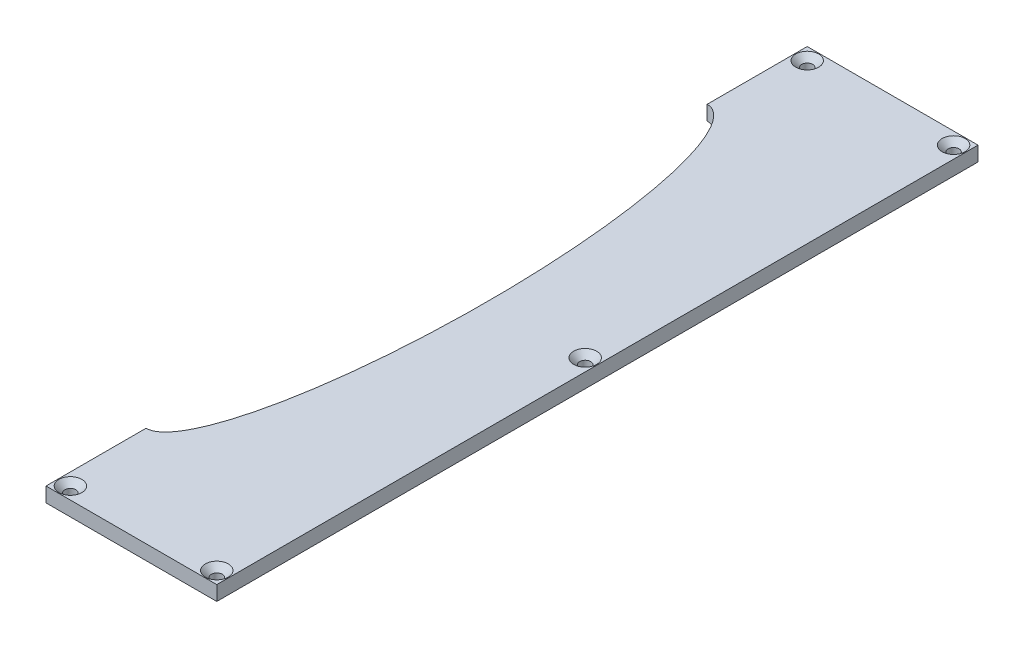
ISO-10303-21;
HEADER;
FILE_DESCRIPTION(('STEP AP214'),'2;1');
FILE_NAME('part.step','',(''),(''),'','','');
FILE_SCHEMA(('AUTOMOTIVE_DESIGN { 1 0 10303 214 1 1 1 1 }'));
ENDSEC;
DATA;
#1=APPLICATION_CONTEXT('core data for automotive mechanical design processes');
#2=APPLICATION_PROTOCOL_DEFINITION('international standard','automotive_design',2000,#1);
#3=PRODUCT_CONTEXT('',#1,'mechanical');
#4=PRODUCT('Part','Part','',(#3));
#5=PRODUCT_RELATED_PRODUCT_CATEGORY('part','',(#4));
#6=PRODUCT_DEFINITION_FORMATION('','',#4);
#7=PRODUCT_DEFINITION_CONTEXT('part definition',#1,'design');
#8=PRODUCT_DEFINITION('design','',#6,#7);
#9=PRODUCT_DEFINITION_SHAPE('','',#8);
#10=(LENGTH_UNIT() NAMED_UNIT(*) SI_UNIT(.MILLI.,.METRE.));
#11=(NAMED_UNIT(*) PLANE_ANGLE_UNIT() SI_UNIT($,.RADIAN.));
#12=(NAMED_UNIT(*) SI_UNIT($,.STERADIAN.) SOLID_ANGLE_UNIT());
#13=UNCERTAINTY_MEASURE_WITH_UNIT(LENGTH_MEASURE(1.E-05),#10,'distance_accuracy_value','');
#14=(GEOMETRIC_REPRESENTATION_CONTEXT(3) GLOBAL_UNCERTAINTY_ASSIGNED_CONTEXT((#13)) GLOBAL_UNIT_ASSIGNED_CONTEXT((#10,
#11,#12)) REPRESENTATION_CONTEXT('',''));
#15=CARTESIAN_POINT('',(0.,0.,0.));
#16=DIRECTION('',(0.,0.,1.));
#17=DIRECTION('',(1.,0.,0.));
#18=AXIS2_PLACEMENT_3D('',#15,#16,#17);
#19=CARTESIAN_POINT('',(0.,6.,0.));
#20=DIRECTION('',(0.,1.,0.));
#21=DIRECTION('',(0.,0.,-1.));
#22=AXIS2_PLACEMENT_3D('',#19,#20,#21);
#23=ELLIPSE('',#22,115.,25.);
#24=DIRECTION('',(0.,-1.,0.));
#25=VECTOR('',#24,1.);
#26=SURFACE_OF_LINEAR_EXTRUSION('',#23,#25);
#27=CARTESIAN_POINT('',(0.,0.,0.));
#28=DIRECTION('',(0.,1.,0.));
#29=DIRECTION('',(0.,0.,-1.));
#30=AXIS2_PLACEMENT_3D('',#27,#28,#29);
#31=ELLIPSE('',#30,115.,25.);
#32=CARTESIAN_POINT('',(0.,0.,115.));
#33=VERTEX_POINT('',#32);
#34=CARTESIAN_POINT('',(0.,0.,-115.));
#35=VERTEX_POINT('',#34);
#36=EDGE_CURVE('E129',#33,#35,#31,.T.);
#37=ORIENTED_EDGE('',*,*,#36,.F.);
#38=DIRECTION('',(0.,-1.,0.));
#39=VECTOR('',#38,1.);
#40=CARTESIAN_POINT('',(0.,6.,115.));
#41=LINE('',#40,#39);
#42=CARTESIAN_POINT('',(0.,6.,115.));
#43=VERTEX_POINT('',#42);
#44=EDGE_CURVE('E11',#43,#33,#41,.T.);
#45=ORIENTED_EDGE('',*,*,#44,.F.);
#46=CARTESIAN_POINT('',(0.,6.,-115.));
#47=VERTEX_POINT('',#46);
#48=EDGE_CURVE('E150',#43,#47,#23,.T.);
#49=ORIENTED_EDGE('',*,*,#48,.T.);
#50=DIRECTION('',(0.,-1.,0.));
#51=VECTOR('',#50,1.);
#52=CARTESIAN_POINT('',(0.,6.,-115.));
#53=LINE('',#52,#51);
#54=EDGE_CURVE('E60',#47,#35,#53,.T.);
#55=ORIENTED_EDGE('',*,*,#54,.T.);
#56=EDGE_LOOP('',(#37,#45,#49,#55));
#57=FACE_BOUND('',#56,.T.);
#58=ADVANCED_FACE('F40',(#57),#26,.T.);
#59=CARTESIAN_POINT('',(0.,6.,0.));
#60=DIRECTION('',(-1.,0.,0.));
#61=DIRECTION('',(0.,0.,1.));
#62=AXIS2_PLACEMENT_3D('',#59,#60,#61);
#63=PLANE('',#62);
#64=DIRECTION('',(0.,0.,-1.));
#65=VECTOR('',#64,1.);
#66=CARTESIAN_POINT('',(0.,0.,0.));
#67=LINE('',#66,#65);
#68=CARTESIAN_POINT('',(0.,0.,156.));
#69=VERTEX_POINT('',#68);
#70=EDGE_CURVE('E132',#69,#33,#67,.T.);
#71=ORIENTED_EDGE('',*,*,#70,.F.);
#72=DIRECTION('',(0.,-1.,0.));
#73=VECTOR('',#72,1.);
#74=CARTESIAN_POINT('',(0.,6.,156.));
#75=LINE('',#74,#73);
#76=CARTESIAN_POINT('',(0.,6.,156.));
#77=VERTEX_POINT('',#76);
#78=EDGE_CURVE('E51',#77,#69,#75,.T.);
#79=ORIENTED_EDGE('',*,*,#78,.F.);
#80=DIRECTION('',(0.,0.,-1.));
#81=VECTOR('',#80,1.);
#82=CARTESIAN_POINT('',(0.,6.,0.));
#83=LINE('',#82,#81);
#84=EDGE_CURVE('E212',#77,#43,#83,.T.);
#85=ORIENTED_EDGE('',*,*,#84,.T.);
#86=ORIENTED_EDGE('',*,*,#44,.T.);
#87=EDGE_LOOP('',(#71,#79,#85,#86));
#88=FACE_BOUND('',#87,.T.);
#89=ADVANCED_FACE('F235',(#88),#63,.T.);
#90=CARTESIAN_POINT('',(0.,6.,156.));
#91=DIRECTION('',(0.,0.,1.));
#92=DIRECTION('',(1.,0.,0.));
#93=AXIS2_PLACEMENT_3D('',#90,#91,#92);
#94=PLANE('',#93);
#95=DIRECTION('',(-1.,0.,0.));
#96=VECTOR('',#95,1.);
#97=CARTESIAN_POINT('',(0.,0.,156.));
#98=LINE('',#97,#96);
#99=CARTESIAN_POINT('',(70.0000000000001,0.,156.));
#100=VERTEX_POINT('',#99);
#101=EDGE_CURVE('E137',#100,#69,#98,.T.);
#102=ORIENTED_EDGE('',*,*,#101,.F.);
#103=DIRECTION('',(0.,-1.,0.));
#104=VECTOR('',#103,1.);
#105=CARTESIAN_POINT('',(70.0000000000001,6.,156.));
#106=LINE('',#105,#104);
#107=CARTESIAN_POINT('',(70.0000000000001,6.,156.));
#108=VERTEX_POINT('',#107);
#109=EDGE_CURVE('E108',#108,#100,#106,.T.);
#110=ORIENTED_EDGE('',*,*,#109,.F.);
#111=DIRECTION('',(-1.,0.,0.));
#112=VECTOR('',#111,1.);
#113=CARTESIAN_POINT('',(0.,6.,156.));
#114=LINE('',#113,#112);
#115=EDGE_CURVE('E118',#108,#77,#114,.T.);
#116=ORIENTED_EDGE('',*,*,#115,.T.);
#117=ORIENTED_EDGE('',*,*,#78,.T.);
#118=EDGE_LOOP('',(#102,#110,#116,#117));
#119=FACE_BOUND('',#118,.T.);
#120=ADVANCED_FACE('F218',(#119),#94,.T.);
#121=CARTESIAN_POINT('',(70.,6.,0.));
#122=DIRECTION('',(1.,0.,0.));
#123=DIRECTION('',(0.,0.,-1.));
#124=AXIS2_PLACEMENT_3D('',#121,#122,#123);
#125=PLANE('',#124);
#126=DIRECTION('',(0.,0.,1.));
#127=VECTOR('',#126,1.);
#128=CARTESIAN_POINT('',(70.,0.,0.));
#129=LINE('',#128,#127);
#130=CARTESIAN_POINT('',(70.,0.,-156.));
#131=VERTEX_POINT('',#130);
#132=EDGE_CURVE('E103',#131,#100,#129,.T.);
#133=ORIENTED_EDGE('',*,*,#132,.F.);
#134=DIRECTION('',(0.,-1.,0.));
#135=VECTOR('',#134,1.);
#136=CARTESIAN_POINT('',(70.,6.,-156.));
#137=LINE('',#136,#135);
#138=CARTESIAN_POINT('',(70.,6.,-156.));
#139=VERTEX_POINT('',#138);
#140=EDGE_CURVE('E98',#139,#131,#137,.T.);
#141=ORIENTED_EDGE('',*,*,#140,.F.);
#142=DIRECTION('',(0.,0.,1.));
#143=VECTOR('',#142,1.);
#144=CARTESIAN_POINT('',(70.,6.,0.));
#145=LINE('',#144,#143);
#146=EDGE_CURVE('E101',#139,#108,#145,.T.);
#147=ORIENTED_EDGE('',*,*,#146,.T.);
#148=ORIENTED_EDGE('',*,*,#109,.T.);
#149=EDGE_LOOP('',(#133,#141,#147,#148));
#150=FACE_BOUND('',#149,.T.);
#151=ADVANCED_FACE('F100',(#150),#125,.T.);
#152=CARTESIAN_POINT('',(0.,6.,-156.));
#153=DIRECTION('',(0.,0.,-1.));
#154=DIRECTION('',(-1.,0.,0.));
#155=AXIS2_PLACEMENT_3D('',#152,#153,#154);
#156=PLANE('',#155);
#157=DIRECTION('',(1.,0.,0.));
#158=VECTOR('',#157,1.);
#159=CARTESIAN_POINT('',(0.,0.,-156.));
#160=LINE('',#159,#158);
#161=CARTESIAN_POINT('',(0.,0.,-156.));
#162=VERTEX_POINT('',#161);
#163=EDGE_CURVE('E143',#162,#131,#160,.T.);
#164=ORIENTED_EDGE('',*,*,#163,.F.);
#165=DIRECTION('',(0.,-1.,0.));
#166=VECTOR('',#165,1.);
#167=CARTESIAN_POINT('',(0.,6.,-156.));
#168=LINE('',#167,#166);
#169=CARTESIAN_POINT('',(0.,6.,-156.));
#170=VERTEX_POINT('',#169);
#171=EDGE_CURVE('E79',#170,#162,#168,.T.);
#172=ORIENTED_EDGE('',*,*,#171,.F.);
#173=DIRECTION('',(1.,0.,0.));
#174=VECTOR('',#173,1.);
#175=CARTESIAN_POINT('',(0.,6.,-156.));
#176=LINE('',#175,#174);
#177=EDGE_CURVE('E115',#170,#139,#176,.T.);
#178=ORIENTED_EDGE('',*,*,#177,.T.);
#179=ORIENTED_EDGE('',*,*,#140,.T.);
#180=EDGE_LOOP('',(#164,#172,#178,#179));
#181=FACE_BOUND('',#180,.T.);
#182=ADVANCED_FACE('F121',(#181),#156,.T.);
#183=CARTESIAN_POINT('',(0.,6.,0.));
#184=DIRECTION('',(-1.,0.,0.));
#185=DIRECTION('',(0.,0.,1.));
#186=AXIS2_PLACEMENT_3D('',#183,#184,#185);
#187=PLANE('',#186);
#188=DIRECTION('',(0.,0.,-1.));
#189=VECTOR('',#188,1.);
#190=CARTESIAN_POINT('',(0.,0.,0.));
#191=LINE('',#190,#189);
#192=EDGE_CURVE('E146',#35,#162,#191,.T.);
#193=ORIENTED_EDGE('',*,*,#192,.F.);
#194=ORIENTED_EDGE('',*,*,#54,.F.);
#195=DIRECTION('',(0.,0.,-1.));
#196=VECTOR('',#195,1.);
#197=CARTESIAN_POINT('',(0.,6.,0.));
#198=LINE('',#197,#196);
#199=EDGE_CURVE('E123',#47,#170,#198,.T.);
#200=ORIENTED_EDGE('',*,*,#199,.T.);
#201=ORIENTED_EDGE('',*,*,#171,.T.);
#202=EDGE_LOOP('',(#193,#194,#200,#201));
#203=FACE_BOUND('',#202,.T.);
#204=ADVANCED_FACE('F222',(#203),#187,.T.);
#205=CARTESIAN_POINT('',(0.,6.,0.));
#206=DIRECTION('',(0.,1.,0.));
#207=DIRECTION('',(0.,0.,1.));
#208=AXIS2_PLACEMENT_3D('',#205,#206,#207);
#209=PLANE('',#208);
#210=CARTESIAN_POINT('',(5.,6.,-151.));
#211=DIRECTION('',(0.,1.,0.));
#212=DIRECTION('',(0.,0.,1.));
#213=AXIS2_PLACEMENT_3D('',#210,#211,#212);
#214=CIRCLE('',#213,4.7);
#215=CARTESIAN_POINT('',(5.,6.,-146.3));
#216=VERTEX_POINT('',#215);
#217=EDGE_CURVE('E376',#216,#216,#214,.T.);
#218=ORIENTED_EDGE('',*,*,#217,.F.);
#219=EDGE_LOOP('',(#218));
#220=FACE_BOUND('',#219,.T.);
#221=CARTESIAN_POINT('',(65.,6.,-151.));
#222=DIRECTION('',(0.,1.,0.));
#223=DIRECTION('',(0.,0.,1.));
#224=AXIS2_PLACEMENT_3D('',#221,#222,#223);
#225=CIRCLE('',#224,4.7);
#226=CARTESIAN_POINT('',(65.,6.,-146.3));
#227=VERTEX_POINT('',#226);
#228=EDGE_CURVE('E186',#227,#227,#225,.T.);
#229=ORIENTED_EDGE('',*,*,#228,.F.);
#230=EDGE_LOOP('',(#229));
#231=FACE_BOUND('',#230,.T.);
#232=CARTESIAN_POINT('',(65.,6.,0.));
#233=DIRECTION('',(0.,1.,0.));
#234=DIRECTION('',(0.,0.,1.));
#235=AXIS2_PLACEMENT_3D('',#232,#233,#234);
#236=CIRCLE('',#235,4.7);
#237=CARTESIAN_POINT('',(65.,6.,4.7));
#238=VERTEX_POINT('',#237);
#239=EDGE_CURVE('E177',#238,#238,#236,.T.);
#240=ORIENTED_EDGE('',*,*,#239,.F.);
#241=EDGE_LOOP('',(#240));
#242=FACE_BOUND('',#241,.T.);
#243=CARTESIAN_POINT('',(65.,6.,151.));
#244=DIRECTION('',(0.,1.,0.));
#245=DIRECTION('',(0.,0.,1.));
#246=AXIS2_PLACEMENT_3D('',#243,#244,#245);
#247=CIRCLE('',#246,4.7);
#248=CARTESIAN_POINT('',(65.,6.,155.7));
#249=VERTEX_POINT('',#248);
#250=EDGE_CURVE('E172',#249,#249,#247,.T.);
#251=ORIENTED_EDGE('',*,*,#250,.F.);
#252=EDGE_LOOP('',(#251));
#253=FACE_BOUND('',#252,.T.);
#254=CARTESIAN_POINT('',(5.,6.,151.));
#255=DIRECTION('',(0.,1.,0.));
#256=DIRECTION('',(0.,0.,1.));
#257=AXIS2_PLACEMENT_3D('',#254,#255,#256);
#258=CIRCLE('',#257,4.7);
#259=CARTESIAN_POINT('',(5.,6.,155.7));
#260=VERTEX_POINT('',#259);
#261=EDGE_CURVE('E167',#260,#260,#258,.T.);
#262=ORIENTED_EDGE('',*,*,#261,.F.);
#263=EDGE_LOOP('',(#262));
#264=FACE_BOUND('',#263,.T.);
#265=ORIENTED_EDGE('',*,*,#48,.F.);
#266=ORIENTED_EDGE('',*,*,#84,.F.);
#267=ORIENTED_EDGE('',*,*,#115,.F.);
#268=ORIENTED_EDGE('',*,*,#146,.F.);
#269=ORIENTED_EDGE('',*,*,#177,.F.);
#270=ORIENTED_EDGE('',*,*,#199,.F.);
#271=EDGE_LOOP('',(#265,#266,#267,#268,#269,#270));
#272=FACE_BOUND('',#271,.T.);
#273=ADVANCED_FACE('F113',(#220,#231,#242,#253,#264,#272),#209,.T.);
#274=CARTESIAN_POINT('',(0.,0.,0.));
#275=DIRECTION('',(0.,1.,0.));
#276=DIRECTION('',(0.,0.,1.));
#277=AXIS2_PLACEMENT_3D('',#274,#275,#276);
#278=PLANE('',#277);
#279=CARTESIAN_POINT('',(5.,0.,-151.));
#280=DIRECTION('',(0.,1.,0.));
#281=DIRECTION('',(0.,0.,1.));
#282=AXIS2_PLACEMENT_3D('',#279,#280,#281);
#283=CIRCLE('',#282,2.24999999999999);
#284=CARTESIAN_POINT('',(5.,0.,-148.75));
#285=VERTEX_POINT('',#284);
#286=EDGE_CURVE('E44',#285,#285,#283,.T.);
#287=ORIENTED_EDGE('',*,*,#286,.T.);
#288=EDGE_LOOP('',(#287));
#289=FACE_BOUND('',#288,.T.);
#290=CARTESIAN_POINT('',(65.,0.,-151.));
#291=DIRECTION('',(0.,1.,0.));
#292=DIRECTION('',(0.,0.,1.));
#293=AXIS2_PLACEMENT_3D('',#290,#291,#292);
#294=CIRCLE('',#293,2.24999999999999);
#295=CARTESIAN_POINT('',(65.,0.,-148.75));
#296=VERTEX_POINT('',#295);
#297=EDGE_CURVE('E174',#296,#296,#294,.T.);
#298=ORIENTED_EDGE('',*,*,#297,.T.);
#299=EDGE_LOOP('',(#298));
#300=FACE_BOUND('',#299,.T.);
#301=CARTESIAN_POINT('',(65.,0.,0.));
#302=DIRECTION('',(0.,1.,0.));
#303=DIRECTION('',(0.,0.,1.));
#304=AXIS2_PLACEMENT_3D('',#301,#302,#303);
#305=CIRCLE('',#304,2.24999999999999);
#306=CARTESIAN_POINT('',(65.,0.,2.24999999999999));
#307=VERTEX_POINT('',#306);
#308=EDGE_CURVE('E169',#307,#307,#305,.T.);
#309=ORIENTED_EDGE('',*,*,#308,.T.);
#310=EDGE_LOOP('',(#309));
#311=FACE_BOUND('',#310,.T.);
#312=CARTESIAN_POINT('',(65.,0.,151.));
#313=DIRECTION('',(0.,1.,0.));
#314=DIRECTION('',(0.,0.,1.));
#315=AXIS2_PLACEMENT_3D('',#312,#313,#314);
#316=CIRCLE('',#315,2.24999999999999);
#317=CARTESIAN_POINT('',(65.,0.,153.25));
#318=VERTEX_POINT('',#317);
#319=EDGE_CURVE('E163',#318,#318,#316,.T.);
#320=ORIENTED_EDGE('',*,*,#319,.T.);
#321=EDGE_LOOP('',(#320));
#322=FACE_BOUND('',#321,.T.);
#323=CARTESIAN_POINT('',(5.,0.,151.));
#324=DIRECTION('',(0.,1.,0.));
#325=DIRECTION('',(0.,0.,1.));
#326=AXIS2_PLACEMENT_3D('',#323,#324,#325);
#327=CIRCLE('',#326,2.24999999999999);
#328=CARTESIAN_POINT('',(5.,0.,153.25));
#329=VERTEX_POINT('',#328);
#330=EDGE_CURVE('E133',#329,#329,#327,.T.);
#331=ORIENTED_EDGE('',*,*,#330,.T.);
#332=EDGE_LOOP('',(#331));
#333=FACE_BOUND('',#332,.T.);
#334=ORIENTED_EDGE('',*,*,#36,.T.);
#335=ORIENTED_EDGE('',*,*,#192,.T.);
#336=ORIENTED_EDGE('',*,*,#163,.T.);
#337=ORIENTED_EDGE('',*,*,#132,.T.);
#338=ORIENTED_EDGE('',*,*,#101,.T.);
#339=ORIENTED_EDGE('',*,*,#70,.T.);
#340=EDGE_LOOP('',(#334,#335,#336,#337,#338,#339));
#341=FACE_BOUND('',#340,.T.);
#342=ADVANCED_FACE('F221',(#289,#300,#311,#322,#333,#341),#278,.F.);
#343=CARTESIAN_POINT('',(5.,6.,151.));
#344=DIRECTION('',(0.,1.,0.));
#345=DIRECTION('',(0.,0.,1.));
#346=AXIS2_PLACEMENT_3D('',#343,#344,#345);
#347=CYLINDRICAL_SURFACE('',#346,2.24999999999999);
#348=CARTESIAN_POINT('',(5.,3.54999999999999,151.));
#349=DIRECTION('',(0.,1.,0.));
#350=DIRECTION('',(0.,0.,1.));
#351=AXIS2_PLACEMENT_3D('',#348,#349,#350);
#352=CIRCLE('',#351,2.24999999999999);
#353=CARTESIAN_POINT('',(5.,3.54999999999999,153.25));
#354=VERTEX_POINT('',#353);
#355=EDGE_CURVE('E162',#354,#354,#352,.T.);
#356=ORIENTED_EDGE('',*,*,#355,.T.);
#357=EDGE_LOOP('',(#356));
#358=FACE_BOUND('',#357,.T.);
#359=ORIENTED_EDGE('',*,*,#330,.F.);
#360=EDGE_LOOP('',(#359));
#361=FACE_BOUND('',#360,.T.);
#362=ADVANCED_FACE('F269',(#358,#361),#347,.F.);
#363=CARTESIAN_POINT('',(5.,6.,151.));
#364=DIRECTION('',(0.,1.,0.));
#365=DIRECTION('',(0.,0.,1.));
#366=AXIS2_PLACEMENT_3D('',#363,#364,#365);
#367=CONICAL_SURFACE('',#366,4.7,0.785398163397449);
#368=ORIENTED_EDGE('',*,*,#355,.F.);
#369=EDGE_LOOP('',(#368));
#370=FACE_BOUND('',#369,.T.);
#371=ORIENTED_EDGE('',*,*,#261,.T.);
#372=EDGE_LOOP('',(#371));
#373=FACE_BOUND('',#372,.T.);
#374=ADVANCED_FACE('F277',(#370,#373),#367,.F.);
#375=CARTESIAN_POINT('',(65.,6.,151.));
#376=DIRECTION('',(0.,1.,0.));
#377=DIRECTION('',(0.,0.,1.));
#378=AXIS2_PLACEMENT_3D('',#375,#376,#377);
#379=CYLINDRICAL_SURFACE('',#378,2.24999999999999);
#380=CARTESIAN_POINT('',(65.,3.54999999999999,151.));
#381=DIRECTION('',(0.,1.,0.));
#382=DIRECTION('',(0.,0.,1.));
#383=AXIS2_PLACEMENT_3D('',#380,#381,#382);
#384=CIRCLE('',#383,2.24999999999999);
#385=CARTESIAN_POINT('',(65.,3.54999999999999,153.25));
#386=VERTEX_POINT('',#385);
#387=EDGE_CURVE('E168',#386,#386,#384,.T.);
#388=ORIENTED_EDGE('',*,*,#387,.T.);
#389=EDGE_LOOP('',(#388));
#390=FACE_BOUND('',#389,.T.);
#391=ORIENTED_EDGE('',*,*,#319,.F.);
#392=EDGE_LOOP('',(#391));
#393=FACE_BOUND('',#392,.T.);
#394=ADVANCED_FACE('F287',(#390,#393),#379,.F.);
#395=CARTESIAN_POINT('',(65.,6.,151.));
#396=DIRECTION('',(0.,1.,0.));
#397=DIRECTION('',(0.,0.,1.));
#398=AXIS2_PLACEMENT_3D('',#395,#396,#397);
#399=CONICAL_SURFACE('',#398,4.7,0.785398163397448);
#400=ORIENTED_EDGE('',*,*,#387,.F.);
#401=EDGE_LOOP('',(#400));
#402=FACE_BOUND('',#401,.T.);
#403=ORIENTED_EDGE('',*,*,#250,.T.);
#404=EDGE_LOOP('',(#403));
#405=FACE_BOUND('',#404,.T.);
#406=ADVANCED_FACE('F297',(#402,#405),#399,.F.);
#407=CARTESIAN_POINT('',(65.,6.,0.));
#408=DIRECTION('',(0.,1.,0.));
#409=DIRECTION('',(0.,0.,1.));
#410=AXIS2_PLACEMENT_3D('',#407,#408,#409);
#411=CYLINDRICAL_SURFACE('',#410,2.24999999999999);
#412=CARTESIAN_POINT('',(65.,3.54999999999999,0.));
#413=DIRECTION('',(0.,1.,0.));
#414=DIRECTION('',(0.,0.,1.));
#415=AXIS2_PLACEMENT_3D('',#412,#413,#414);
#416=CIRCLE('',#415,2.24999999999999);
#417=CARTESIAN_POINT('',(65.,3.54999999999999,2.24999999999999));
#418=VERTEX_POINT('',#417);
#419=EDGE_CURVE('E173',#418,#418,#416,.T.);
#420=ORIENTED_EDGE('',*,*,#419,.T.);
#421=EDGE_LOOP('',(#420));
#422=FACE_BOUND('',#421,.T.);
#423=ORIENTED_EDGE('',*,*,#308,.F.);
#424=EDGE_LOOP('',(#423));
#425=FACE_BOUND('',#424,.T.);
#426=ADVANCED_FACE('F307',(#422,#425),#411,.F.);
#427=CARTESIAN_POINT('',(65.,6.,0.));
#428=DIRECTION('',(0.,1.,0.));
#429=DIRECTION('',(0.,0.,1.));
#430=AXIS2_PLACEMENT_3D('',#427,#428,#429);
#431=CONICAL_SURFACE('',#430,4.7,0.785398163397448);
#432=ORIENTED_EDGE('',*,*,#419,.F.);
#433=EDGE_LOOP('',(#432));
#434=FACE_BOUND('',#433,.T.);
#435=ORIENTED_EDGE('',*,*,#239,.T.);
#436=EDGE_LOOP('',(#435));
#437=FACE_BOUND('',#436,.T.);
#438=ADVANCED_FACE('F317',(#434,#437),#431,.F.);
#439=CARTESIAN_POINT('',(65.,6.,-151.));
#440=DIRECTION('',(0.,1.,0.));
#441=DIRECTION('',(0.,0.,1.));
#442=AXIS2_PLACEMENT_3D('',#439,#440,#441);
#443=CYLINDRICAL_SURFACE('',#442,2.24999999999999);
#444=CARTESIAN_POINT('',(65.,3.54999999999999,-151.));
#445=DIRECTION('',(0.,1.,0.));
#446=DIRECTION('',(0.,0.,1.));
#447=AXIS2_PLACEMENT_3D('',#444,#445,#446);
#448=CIRCLE('',#447,2.24999999999999);
#449=CARTESIAN_POINT('',(65.,3.54999999999999,-148.75));
#450=VERTEX_POINT('',#449);
#451=EDGE_CURVE('E178',#450,#450,#448,.T.);
#452=ORIENTED_EDGE('',*,*,#451,.T.);
#453=EDGE_LOOP('',(#452));
#454=FACE_BOUND('',#453,.T.);
#455=ORIENTED_EDGE('',*,*,#297,.F.);
#456=EDGE_LOOP('',(#455));
#457=FACE_BOUND('',#456,.T.);
#458=ADVANCED_FACE('F327',(#454,#457),#443,.F.);
#459=CARTESIAN_POINT('',(65.,6.,-151.));
#460=DIRECTION('',(0.,1.,0.));
#461=DIRECTION('',(0.,0.,1.));
#462=AXIS2_PLACEMENT_3D('',#459,#460,#461);
#463=CONICAL_SURFACE('',#462,4.7,0.785398163397448);
#464=ORIENTED_EDGE('',*,*,#451,.F.);
#465=EDGE_LOOP('',(#464));
#466=FACE_BOUND('',#465,.T.);
#467=ORIENTED_EDGE('',*,*,#228,.T.);
#468=EDGE_LOOP('',(#467));
#469=FACE_BOUND('',#468,.T.);
#470=ADVANCED_FACE('F337',(#466,#469),#463,.F.);
#471=CARTESIAN_POINT('',(5.,6.,-151.));
#472=DIRECTION('',(0.,1.,0.));
#473=DIRECTION('',(0.,0.,1.));
#474=AXIS2_PLACEMENT_3D('',#471,#472,#473);
#475=CYLINDRICAL_SURFACE('',#474,2.24999999999999);
#476=CARTESIAN_POINT('',(5.,3.54999999999999,-151.));
#477=DIRECTION('',(0.,1.,0.));
#478=DIRECTION('',(0.,0.,1.));
#479=AXIS2_PLACEMENT_3D('',#476,#477,#478);
#480=CIRCLE('',#479,2.24999999999999);
#481=CARTESIAN_POINT('',(5.,3.54999999999999,-148.75));
#482=VERTEX_POINT('',#481);
#483=EDGE_CURVE('E373',#482,#482,#480,.T.);
#484=ORIENTED_EDGE('',*,*,#483,.T.);
#485=EDGE_LOOP('',(#484));
#486=FACE_BOUND('',#485,.T.);
#487=ORIENTED_EDGE('',*,*,#286,.F.);
#488=EDGE_LOOP('',(#487));
#489=FACE_BOUND('',#488,.T.);
#490=ADVANCED_FACE('F346',(#486,#489),#475,.F.);
#491=CARTESIAN_POINT('',(5.,6.,-151.));
#492=DIRECTION('',(0.,1.,0.));
#493=DIRECTION('',(0.,0.,1.));
#494=AXIS2_PLACEMENT_3D('',#491,#492,#493);
#495=CONICAL_SURFACE('',#494,4.7,0.785398163397449);
#496=ORIENTED_EDGE('',*,*,#483,.F.);
#497=EDGE_LOOP('',(#496));
#498=FACE_BOUND('',#497,.T.);
#499=ORIENTED_EDGE('',*,*,#217,.T.);
#500=EDGE_LOOP('',(#499));
#501=FACE_BOUND('',#500,.T.);
#502=ADVANCED_FACE('F356',(#498,#501),#495,.F.);
#503=CLOSED_SHELL('',(#58,#89,#120,#151,#182,#204,#273,#342,#362,#374,#394,#406,#426,#438,#458,
#470,#490,#502));
#504=MANIFOLD_SOLID_BREP('B2',#503);
#505=ADVANCED_BREP_SHAPE_REPRESENTATION('',(#18,#504),#14);
#506=SHAPE_DEFINITION_REPRESENTATION(#9,#505);
ENDSEC;
END-ISO-10303-21;
